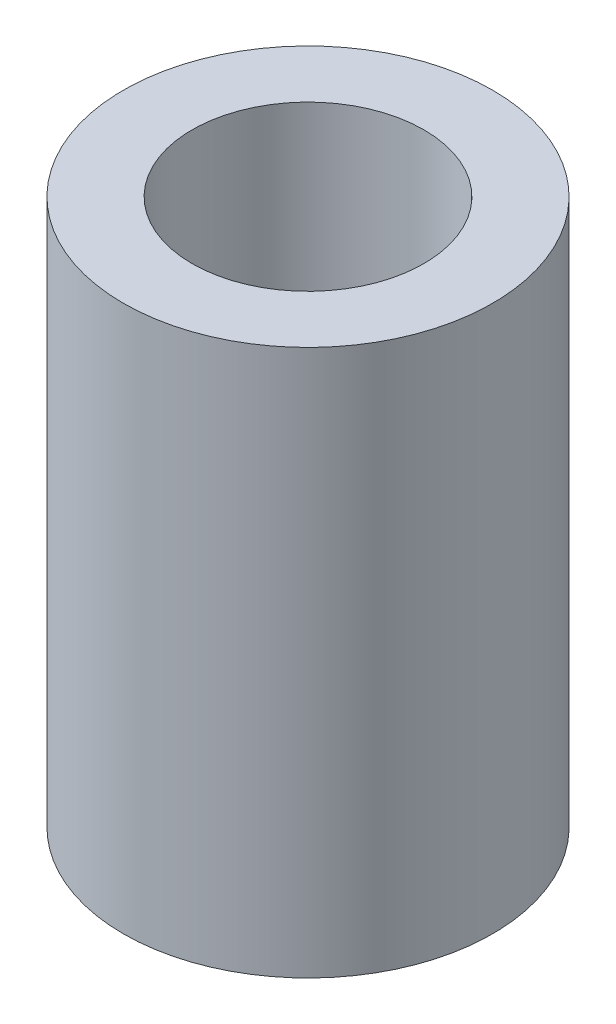
ISO-10303-21;
HEADER;
FILE_DESCRIPTION(('STEP AP214'),'2;1');
FILE_NAME('part.step','',(''),(''),'','','');
FILE_SCHEMA(('AUTOMOTIVE_DESIGN { 1 0 10303 214 1 1 1 1 }'));
ENDSEC;
DATA;
#1=APPLICATION_CONTEXT('core data for automotive mechanical design processes');
#2=APPLICATION_PROTOCOL_DEFINITION('international standard','automotive_design',2000,#1);
#3=PRODUCT_CONTEXT('',#1,'mechanical');
#4=PRODUCT('Part','Part','',(#3));
#5=PRODUCT_RELATED_PRODUCT_CATEGORY('part','',(#4));
#6=PRODUCT_DEFINITION_FORMATION('','',#4);
#7=PRODUCT_DEFINITION_CONTEXT('part definition',#1,'design');
#8=PRODUCT_DEFINITION('design','',#6,#7);
#9=PRODUCT_DEFINITION_SHAPE('','',#8);
#10=(LENGTH_UNIT() NAMED_UNIT(*) SI_UNIT(.MILLI.,.METRE.));
#11=(NAMED_UNIT(*) PLANE_ANGLE_UNIT() SI_UNIT($,.RADIAN.));
#12=(NAMED_UNIT(*) SI_UNIT($,.STERADIAN.) SOLID_ANGLE_UNIT());
#13=UNCERTAINTY_MEASURE_WITH_UNIT(LENGTH_MEASURE(1.E-05),#10,'distance_accuracy_value','');
#14=(GEOMETRIC_REPRESENTATION_CONTEXT(3) GLOBAL_UNCERTAINTY_ASSIGNED_CONTEXT((#13)) GLOBAL_UNIT_ASSIGNED_CONTEXT((#10,
#11,#12)) REPRESENTATION_CONTEXT('',''));
#15=CARTESIAN_POINT('',(0.,0.,0.));
#16=DIRECTION('',(0.,0.,1.));
#17=DIRECTION('',(1.,0.,0.));
#18=AXIS2_PLACEMENT_3D('',#15,#16,#17);
#19=CARTESIAN_POINT('',(0.,15.9,0.));
#20=DIRECTION('',(0.,1.,0.));
#21=DIRECTION('',(0.,0.,1.));
#22=AXIS2_PLACEMENT_3D('',#19,#20,#21);
#23=PLANE('',#22);
#24=CARTESIAN_POINT('',(0.,15.9,0.));
#25=DIRECTION('',(0.,1.,0.));
#26=DIRECTION('',(0.,0.,1.));
#27=AXIS2_PLACEMENT_3D('',#24,#25,#26);
#28=CIRCLE('',#27,5.375);
#29=CARTESIAN_POINT('',(0.,15.9,5.375));
#30=VERTEX_POINT('',#29);
#31=EDGE_CURVE('E10',#30,#30,#28,.T.);
#32=ORIENTED_EDGE('',*,*,#31,.T.);
#33=EDGE_LOOP('',(#32));
#34=FACE_BOUND('',#33,.T.);
#35=CARTESIAN_POINT('',(0.,15.9,0.));
#36=DIRECTION('',(0.,1.,0.));
#37=DIRECTION('',(0.,0.,1.));
#38=AXIS2_PLACEMENT_3D('',#35,#36,#37);
#39=CIRCLE('',#38,3.375);
#40=CARTESIAN_POINT('',(0.,15.9,3.375));
#41=VERTEX_POINT('',#40);
#42=EDGE_CURVE('E42',#41,#41,#39,.T.);
#43=ORIENTED_EDGE('',*,*,#42,.F.);
#44=EDGE_LOOP('',(#43));
#45=FACE_BOUND('',#44,.T.);
#46=ADVANCED_FACE('F31',(#34,#45),#23,.T.);
#47=CARTESIAN_POINT('',(0.,0.,0.));
#48=DIRECTION('',(0.,1.,0.));
#49=DIRECTION('',(0.,0.,1.));
#50=AXIS2_PLACEMENT_3D('',#47,#48,#49);
#51=PLANE('',#50);
#52=CARTESIAN_POINT('',(0.,0.,0.));
#53=DIRECTION('',(0.,1.,0.));
#54=DIRECTION('',(0.,0.,1.));
#55=AXIS2_PLACEMENT_3D('',#52,#53,#54);
#56=CIRCLE('',#55,5.375);
#57=CARTESIAN_POINT('',(0.,0.,5.375));
#58=VERTEX_POINT('',#57);
#59=EDGE_CURVE('E35',#58,#58,#56,.T.);
#60=ORIENTED_EDGE('',*,*,#59,.F.);
#61=EDGE_LOOP('',(#60));
#62=FACE_BOUND('',#61,.T.);
#63=CARTESIAN_POINT('',(0.,0.,0.));
#64=DIRECTION('',(0.,1.,0.));
#65=DIRECTION('',(0.,0.,1.));
#66=AXIS2_PLACEMENT_3D('',#63,#64,#65);
#67=CIRCLE('',#66,3.375);
#68=CARTESIAN_POINT('',(0.,0.,3.375));
#69=VERTEX_POINT('',#68);
#70=EDGE_CURVE('E44',#69,#69,#67,.T.);
#71=ORIENTED_EDGE('',*,*,#70,.T.);
#72=EDGE_LOOP('',(#71));
#73=FACE_BOUND('',#72,.T.);
#74=ADVANCED_FACE('F54',(#62,#73),#51,.F.);
#75=CARTESIAN_POINT('',(0.,15.9,0.));
#76=DIRECTION('',(0.,-1.,0.));
#77=DIRECTION('',(0.,0.,-1.));
#78=AXIS2_PLACEMENT_3D('',#75,#76,#77);
#79=CYLINDRICAL_SURFACE('',#78,5.375);
#80=ORIENTED_EDGE('',*,*,#31,.F.);
#81=EDGE_LOOP('',(#80));
#82=FACE_BOUND('',#81,.T.);
#83=ORIENTED_EDGE('',*,*,#59,.T.);
#84=EDGE_LOOP('',(#83));
#85=FACE_BOUND('',#84,.T.);
#86=ADVANCED_FACE('F33',(#82,#85),#79,.T.);
#87=CARTESIAN_POINT('',(0.,15.9,0.));
#88=DIRECTION('',(0.,-1.,0.));
#89=DIRECTION('',(0.,0.,-1.));
#90=AXIS2_PLACEMENT_3D('',#87,#88,#89);
#91=CYLINDRICAL_SURFACE('',#90,3.375);
#92=ORIENTED_EDGE('',*,*,#42,.T.);
#93=EDGE_LOOP('',(#92));
#94=FACE_BOUND('',#93,.T.);
#95=ORIENTED_EDGE('',*,*,#70,.F.);
#96=EDGE_LOOP('',(#95));
#97=FACE_BOUND('',#96,.T.);
#98=ADVANCED_FACE('F50',(#94,#97),#91,.F.);
#99=CLOSED_SHELL('',(#46,#74,#86,#98));
#100=MANIFOLD_SOLID_BREP('B2',#99);
#101=ADVANCED_BREP_SHAPE_REPRESENTATION('',(#18,#100),#14);
#102=SHAPE_DEFINITION_REPRESENTATION(#9,#101);
ENDSEC;
END-ISO-10303-21;
